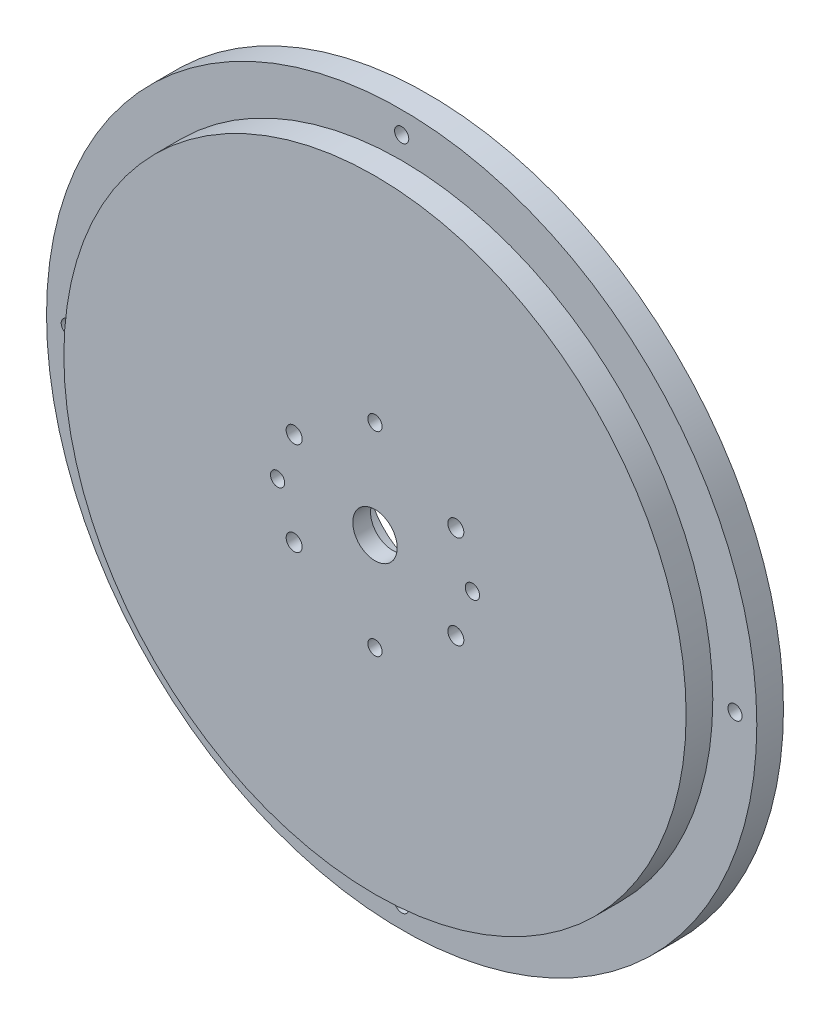
ISO-10303-21;
HEADER;
FILE_DESCRIPTION(('STEP AP214'),'2;1');
FILE_NAME('part.step','',(''),(''),'','','');
FILE_SCHEMA(('AUTOMOTIVE_DESIGN { 1 0 10303 214 1 1 1 1 }'));
ENDSEC;
DATA;
#1=APPLICATION_CONTEXT('core data for automotive mechanical design processes');
#2=APPLICATION_PROTOCOL_DEFINITION('international standard','automotive_design',2000,#1);
#3=PRODUCT_CONTEXT('',#1,'mechanical');
#4=PRODUCT('Part','Part','',(#3));
#5=PRODUCT_RELATED_PRODUCT_CATEGORY('part','',(#4));
#6=PRODUCT_DEFINITION_FORMATION('','',#4);
#7=PRODUCT_DEFINITION_CONTEXT('part definition',#1,'design');
#8=PRODUCT_DEFINITION('design','',#6,#7);
#9=PRODUCT_DEFINITION_SHAPE('','',#8);
#10=(LENGTH_UNIT() NAMED_UNIT(*) SI_UNIT(.MILLI.,.METRE.));
#11=(NAMED_UNIT(*) PLANE_ANGLE_UNIT() SI_UNIT($,.RADIAN.));
#12=(NAMED_UNIT(*) SI_UNIT($,.STERADIAN.) SOLID_ANGLE_UNIT());
#13=UNCERTAINTY_MEASURE_WITH_UNIT(LENGTH_MEASURE(1.E-05),#10,'distance_accuracy_value','');
#14=(GEOMETRIC_REPRESENTATION_CONTEXT(3) GLOBAL_UNCERTAINTY_ASSIGNED_CONTEXT((#13)) GLOBAL_UNIT_ASSIGNED_CONTEXT((#10,
#11,#12)) REPRESENTATION_CONTEXT('',''));
#15=CARTESIAN_POINT('',(0.,0.,0.));
#16=DIRECTION('',(0.,0.,1.));
#17=DIRECTION('',(1.,0.,0.));
#18=AXIS2_PLACEMENT_3D('',#15,#16,#17);
#19=CARTESIAN_POINT('',(0.,0.,20.));
#20=DIRECTION('',(0.,0.,-1.));
#21=DIRECTION('',(-1.,0.,0.));
#22=AXIS2_PLACEMENT_3D('',#19,#20,#21);
#23=CYLINDRICAL_SURFACE('',#22,5.);
#24=CARTESIAN_POINT('',(0.,0.,12.));
#25=DIRECTION('',(0.,0.,1.));
#26=DIRECTION('',(1.,0.,0.));
#27=AXIS2_PLACEMENT_3D('',#24,#25,#26);
#28=CIRCLE('',#27,5.);
#29=CARTESIAN_POINT('',(5.,0.,12.));
#30=VERTEX_POINT('',#29);
#31=EDGE_CURVE('E97',#30,#30,#28,.T.);
#32=ORIENTED_EDGE('',*,*,#31,.T.);
#33=EDGE_LOOP('',(#32));
#34=FACE_BOUND('',#33,.T.);
#35=CARTESIAN_POINT('',(0.,0.,8.));
#36=DIRECTION('',(0.,0.,-1.));
#37=DIRECTION('',(-1.,0.,0.));
#38=AXIS2_PLACEMENT_3D('',#35,#36,#37);
#39=CIRCLE('',#38,5.);
#40=CARTESIAN_POINT('',(-5.,0.,8.));
#41=VERTEX_POINT('',#40);
#42=EDGE_CURVE('E37',#41,#41,#39,.F.);
#43=ORIENTED_EDGE('',*,*,#42,.F.);
#44=EDGE_LOOP('',(#43));
#45=FACE_BOUND('',#44,.T.);
#46=ADVANCED_FACE('F33',(#34,#45),#23,.F.);
#47=CARTESIAN_POINT('',(0.,0.,12.));
#48=DIRECTION('',(0.,0.,-1.));
#49=DIRECTION('',(-1.,0.,0.));
#50=AXIS2_PLACEMENT_3D('',#47,#48,#49);
#51=CYLINDRICAL_SURFACE('',#50,70.);
#52=CARTESIAN_POINT('',(0.,0.,6.));
#53=DIRECTION('',(0.,0.,1.));
#54=DIRECTION('',(1.,0.,0.));
#55=AXIS2_PLACEMENT_3D('',#52,#53,#54);
#56=CIRCLE('',#55,70.);
#57=CARTESIAN_POINT('',(70.,0.,6.));
#58=VERTEX_POINT('',#57);
#59=EDGE_CURVE('E41',#58,#58,#56,.T.);
#60=ORIENTED_EDGE('',*,*,#59,.T.);
#61=EDGE_LOOP('',(#60));
#62=FACE_BOUND('',#61,.T.);
#63=CARTESIAN_POINT('',(0.,0.,12.));
#64=DIRECTION('',(0.,0.,1.));
#65=DIRECTION('',(1.,0.,0.));
#66=AXIS2_PLACEMENT_3D('',#63,#64,#65);
#67=CIRCLE('',#66,70.);
#68=CARTESIAN_POINT('',(70.,0.,12.));
#69=VERTEX_POINT('',#68);
#70=EDGE_CURVE('E10',#69,#69,#67,.T.);
#71=ORIENTED_EDGE('',*,*,#70,.F.);
#72=EDGE_LOOP('',(#71));
#73=FACE_BOUND('',#72,.T.);
#74=ADVANCED_FACE('F35',(#62,#73),#51,.T.);
#75=CARTESIAN_POINT('',(0.,0.,12.));
#76=DIRECTION('',(0.,0.,1.));
#77=DIRECTION('',(1.,0.,0.));
#78=AXIS2_PLACEMENT_3D('',#75,#76,#77);
#79=PLANE('',#78);
#80=CARTESIAN_POINT('',(18.1865334794733,-10.4999999999998,12.));
#81=DIRECTION('',(0.,0.,1.));
#82=DIRECTION('',(1.,0.,0.));
#83=AXIS2_PLACEMENT_3D('',#80,#81,#82);
#84=CIRCLE('',#83,1.8);
#85=CARTESIAN_POINT('',(19.9865334794733,-10.4999999999998,12.));
#86=VERTEX_POINT('',#85);
#87=EDGE_CURVE('E104',#86,#86,#84,.T.);
#88=ORIENTED_EDGE('',*,*,#87,.F.);
#89=EDGE_LOOP('',(#88));
#90=FACE_BOUND('',#89,.T.);
#91=CARTESIAN_POINT('',(-18.1865334794732,-10.5000000000001,12.));
#92=DIRECTION('',(0.,0.,1.));
#93=DIRECTION('',(1.,0.,0.));
#94=AXIS2_PLACEMENT_3D('',#91,#92,#93);
#95=CIRCLE('',#94,1.8);
#96=CARTESIAN_POINT('',(-16.3865334794732,-10.5000000000001,12.));
#97=VERTEX_POINT('',#96);
#98=EDGE_CURVE('E107',#97,#97,#95,.T.);
#99=ORIENTED_EDGE('',*,*,#98,.F.);
#100=EDGE_LOOP('',(#99));
#101=FACE_BOUND('',#100,.T.);
#102=CARTESIAN_POINT('',(-18.1865334794732,10.5,12.));
#103=DIRECTION('',(0.,0.,1.));
#104=DIRECTION('',(1.,0.,0.));
#105=AXIS2_PLACEMENT_3D('',#102,#103,#104);
#106=CIRCLE('',#105,1.8);
#107=CARTESIAN_POINT('',(-16.3865334794732,10.5,12.));
#108=VERTEX_POINT('',#107);
#109=EDGE_CURVE('E110',#108,#108,#106,.T.);
#110=ORIENTED_EDGE('',*,*,#109,.F.);
#111=EDGE_LOOP('',(#110));
#112=FACE_BOUND('',#111,.T.);
#113=CARTESIAN_POINT('',(18.1865334794732,10.5,12.));
#114=DIRECTION('',(0.,0.,1.));
#115=DIRECTION('',(1.,0.,0.));
#116=AXIS2_PLACEMENT_3D('',#113,#114,#115);
#117=CIRCLE('',#116,1.8);
#118=CARTESIAN_POINT('',(19.9865334794732,10.5,12.));
#119=VERTEX_POINT('',#118);
#120=EDGE_CURVE('E113',#119,#119,#117,.T.);
#121=ORIENTED_EDGE('',*,*,#120,.F.);
#122=EDGE_LOOP('',(#121));
#123=FACE_BOUND('',#122,.T.);
#124=ORIENTED_EDGE('',*,*,#31,.F.);
#125=EDGE_LOOP('',(#124));
#126=FACE_BOUND('',#125,.T.);
#127=CARTESIAN_POINT('',(21.9203,0.,12.));
#128=DIRECTION('',(0.,0.,1.));
#129=DIRECTION('',(1.,0.,0.));
#130=AXIS2_PLACEMENT_3D('',#127,#128,#129);
#131=CIRCLE('',#130,1.6);
#132=CARTESIAN_POINT('',(23.5203,0.,12.));
#133=VERTEX_POINT('',#132);
#134=EDGE_CURVE('E83',#133,#133,#131,.T.);
#135=ORIENTED_EDGE('',*,*,#134,.F.);
#136=EDGE_LOOP('',(#135));
#137=FACE_BOUND('',#136,.T.);
#138=CARTESIAN_POINT('',(0.,21.9203000000002,12.));
#139=DIRECTION('',(0.,0.,1.));
#140=DIRECTION('',(1.,0.,0.));
#141=AXIS2_PLACEMENT_3D('',#138,#139,#140);
#142=CIRCLE('',#141,1.6000000000002);
#143=CARTESIAN_POINT('',(1.60000000000028,21.9203000000002,12.));
#144=VERTEX_POINT('',#143);
#145=EDGE_CURVE('E86',#144,#144,#142,.T.);
#146=ORIENTED_EDGE('',*,*,#145,.F.);
#147=EDGE_LOOP('',(#146));
#148=FACE_BOUND('',#147,.T.);
#149=CARTESIAN_POINT('',(-21.9203,-1.53068636783686E-13,12.));
#150=DIRECTION('',(0.,0.,1.));
#151=DIRECTION('',(1.,0.,0.));
#152=AXIS2_PLACEMENT_3D('',#149,#150,#151);
#153=CIRCLE('',#152,1.6);
#154=CARTESIAN_POINT('',(-20.3203,-1.53068636783686E-13,12.));
#155=VERTEX_POINT('',#154);
#156=EDGE_CURVE('E89',#155,#155,#153,.T.);
#157=ORIENTED_EDGE('',*,*,#156,.F.);
#158=EDGE_LOOP('',(#157));
#159=FACE_BOUND('',#158,.T.);
#160=CARTESIAN_POINT('',(5.15091550885208E-13,-21.9202999999998,12.));
#161=DIRECTION('',(0.,0.,1.));
#162=DIRECTION('',(1.,0.,0.));
#163=AXIS2_PLACEMENT_3D('',#160,#161,#162);
#164=CIRCLE('',#163,1.59999999999976);
#165=CARTESIAN_POINT('',(1.60000000000027,-21.9202999999998,12.));
#166=VERTEX_POINT('',#165);
#167=EDGE_CURVE('E70',#166,#166,#164,.T.);
#168=ORIENTED_EDGE('',*,*,#167,.F.);
#169=EDGE_LOOP('',(#168));
#170=FACE_BOUND('',#169,.T.);
#171=ORIENTED_EDGE('',*,*,#70,.T.);
#172=EDGE_LOOP('',(#171));
#173=FACE_BOUND('',#172,.T.);
#174=ADVANCED_FACE('F146',(#90,#101,#112,#123,#126,#137,#148,#159,#170,#173),#79,.T.);
#175=CARTESIAN_POINT('',(0.,0.,6.));
#176=DIRECTION('',(0.,0.,-1.));
#177=DIRECTION('',(-1.,0.,0.));
#178=AXIS2_PLACEMENT_3D('',#175,#176,#177);
#179=CYLINDRICAL_SURFACE('',#178,79.9);
#180=CARTESIAN_POINT('',(0.,0.,6.));
#181=DIRECTION('',(0.,0.,1.));
#182=DIRECTION('',(1.,0.,0.));
#183=AXIS2_PLACEMENT_3D('',#180,#181,#182);
#184=CIRCLE('',#183,79.9);
#185=CARTESIAN_POINT('',(79.9,0.,6.));
#186=VERTEX_POINT('',#185);
#187=EDGE_CURVE('E46',#186,#186,#184,.T.);
#188=ORIENTED_EDGE('',*,*,#187,.F.);
#189=EDGE_LOOP('',(#188));
#190=FACE_BOUND('',#189,.T.);
#191=CARTESIAN_POINT('',(0.,0.,0.));
#192=DIRECTION('',(0.,0.,1.));
#193=DIRECTION('',(1.,0.,0.));
#194=AXIS2_PLACEMENT_3D('',#191,#192,#193);
#195=CIRCLE('',#194,79.9);
#196=CARTESIAN_POINT('',(79.9,0.,0.));
#197=VERTEX_POINT('',#196);
#198=EDGE_CURVE('E48',#197,#197,#195,.T.);
#199=ORIENTED_EDGE('',*,*,#198,.T.);
#200=EDGE_LOOP('',(#199));
#201=FACE_BOUND('',#200,.T.);
#202=ADVANCED_FACE('F188',(#190,#201),#179,.T.);
#203=CARTESIAN_POINT('',(0.,0.,6.));
#204=DIRECTION('',(0.,0.,1.));
#205=DIRECTION('',(1.,0.,0.));
#206=AXIS2_PLACEMENT_3D('',#203,#204,#205);
#207=PLANE('',#206);
#208=CARTESIAN_POINT('',(-75.,0.,6.));
#209=DIRECTION('',(0.,0.,1.));
#210=DIRECTION('',(1.,0.,0.));
#211=AXIS2_PLACEMENT_3D('',#208,#209,#210);
#212=CIRCLE('',#211,1.60000000000001);
#213=CARTESIAN_POINT('',(-73.4,0.,6.));
#214=VERTEX_POINT('',#213);
#215=EDGE_CURVE('E51',#214,#214,#212,.F.);
#216=ORIENTED_EDGE('',*,*,#215,.T.);
#217=EDGE_LOOP('',(#216));
#218=FACE_BOUND('',#217,.T.);
#219=CARTESIAN_POINT('',(75.,0.,6.));
#220=DIRECTION('',(0.,0.,1.));
#221=DIRECTION('',(1.,0.,0.));
#222=AXIS2_PLACEMENT_3D('',#219,#220,#221);
#223=CIRCLE('',#222,1.60000000000001);
#224=CARTESIAN_POINT('',(76.6,0.,6.));
#225=VERTEX_POINT('',#224);
#226=EDGE_CURVE('E56',#225,#225,#223,.F.);
#227=ORIENTED_EDGE('',*,*,#226,.T.);
#228=EDGE_LOOP('',(#227));
#229=FACE_BOUND('',#228,.T.);
#230=CARTESIAN_POINT('',(0.,-75.,6.));
#231=DIRECTION('',(0.,0.,1.));
#232=DIRECTION('',(1.,0.,0.));
#233=AXIS2_PLACEMENT_3D('',#230,#231,#232);
#234=CIRCLE('',#233,1.6);
#235=CARTESIAN_POINT('',(1.6,-75.,6.));
#236=VERTEX_POINT('',#235);
#237=EDGE_CURVE('E59',#236,#236,#234,.F.);
#238=ORIENTED_EDGE('',*,*,#237,.T.);
#239=EDGE_LOOP('',(#238));
#240=FACE_BOUND('',#239,.T.);
#241=CARTESIAN_POINT('',(0.,75.,6.));
#242=DIRECTION('',(0.,0.,1.));
#243=DIRECTION('',(1.,0.,0.));
#244=AXIS2_PLACEMENT_3D('',#241,#242,#243);
#245=CIRCLE('',#244,1.6);
#246=CARTESIAN_POINT('',(1.6,75.,6.));
#247=VERTEX_POINT('',#246);
#248=EDGE_CURVE('E62',#247,#247,#245,.F.);
#249=ORIENTED_EDGE('',*,*,#248,.T.);
#250=EDGE_LOOP('',(#249));
#251=FACE_BOUND('',#250,.T.);
#252=ORIENTED_EDGE('',*,*,#59,.F.);
#253=EDGE_LOOP('',(#252));
#254=FACE_BOUND('',#253,.T.);
#255=ORIENTED_EDGE('',*,*,#187,.T.);
#256=EDGE_LOOP('',(#255));
#257=FACE_BOUND('',#256,.T.);
#258=ADVANCED_FACE('F185',(#218,#229,#240,#251,#254,#257),#207,.T.);
#259=CARTESIAN_POINT('',(0.,0.,0.));
#260=DIRECTION('',(0.,0.,1.));
#261=DIRECTION('',(1.,0.,0.));
#262=AXIS2_PLACEMENT_3D('',#259,#260,#261);
#263=PLANE('',#262);
#264=CARTESIAN_POINT('',(0.,0.,0.));
#265=DIRECTION('',(0.,0.,-1.));
#266=DIRECTION('',(-1.,0.,0.));
#267=AXIS2_PLACEMENT_3D('',#264,#265,#266);
#268=CIRCLE('',#267,14.);
#269=CARTESIAN_POINT('',(-14.,0.,0.));
#270=VERTEX_POINT('',#269);
#271=EDGE_CURVE('E128',#270,#270,#268,.T.);
#272=ORIENTED_EDGE('',*,*,#271,.F.);
#273=EDGE_LOOP('',(#272));
#274=FACE_BOUND('',#273,.T.);
#275=CARTESIAN_POINT('',(18.1865334794733,-10.4999999999998,0.));
#276=DIRECTION('',(0.,0.,-1.));
#277=DIRECTION('',(-1.,0.,0.));
#278=AXIS2_PLACEMENT_3D('',#275,#276,#277);
#279=CIRCLE('',#278,1.8);
#280=CARTESIAN_POINT('',(16.3865334794733,-10.4999999999998,0.));
#281=VERTEX_POINT('',#280);
#282=EDGE_CURVE('E120',#281,#281,#279,.T.);
#283=ORIENTED_EDGE('',*,*,#282,.F.);
#284=EDGE_LOOP('',(#283));
#285=FACE_BOUND('',#284,.T.);
#286=CARTESIAN_POINT('',(-18.1865334794732,-10.5000000000001,0.));
#287=DIRECTION('',(0.,0.,-1.));
#288=DIRECTION('',(-1.,0.,0.));
#289=AXIS2_PLACEMENT_3D('',#286,#287,#288);
#290=CIRCLE('',#289,1.8);
#291=CARTESIAN_POINT('',(-19.9865334794732,-10.5000000000001,0.));
#292=VERTEX_POINT('',#291);
#293=EDGE_CURVE('E123',#292,#292,#290,.T.);
#294=ORIENTED_EDGE('',*,*,#293,.F.);
#295=EDGE_LOOP('',(#294));
#296=FACE_BOUND('',#295,.T.);
#297=CARTESIAN_POINT('',(-18.1865334794732,10.5,0.));
#298=DIRECTION('',(0.,0.,-1.));
#299=DIRECTION('',(-1.,0.,0.));
#300=AXIS2_PLACEMENT_3D('',#297,#298,#299);
#301=CIRCLE('',#300,1.8);
#302=CARTESIAN_POINT('',(-19.9865334794732,10.5,0.));
#303=VERTEX_POINT('',#302);
#304=EDGE_CURVE('E119',#303,#303,#301,.T.);
#305=ORIENTED_EDGE('',*,*,#304,.F.);
#306=EDGE_LOOP('',(#305));
#307=FACE_BOUND('',#306,.T.);
#308=CARTESIAN_POINT('',(18.1865334794732,10.5,0.));
#309=DIRECTION('',(0.,0.,-1.));
#310=DIRECTION('',(-1.,0.,0.));
#311=AXIS2_PLACEMENT_3D('',#308,#309,#310);
#312=CIRCLE('',#311,1.8);
#313=CARTESIAN_POINT('',(16.3865334794732,10.5,0.));
#314=VERTEX_POINT('',#313);
#315=EDGE_CURVE('E116',#314,#314,#312,.T.);
#316=ORIENTED_EDGE('',*,*,#315,.F.);
#317=EDGE_LOOP('',(#316));
#318=FACE_BOUND('',#317,.T.);
#319=CARTESIAN_POINT('',(21.9203,0.,0.));
#320=DIRECTION('',(0.,0.,-1.));
#321=DIRECTION('',(-1.,0.,0.));
#322=AXIS2_PLACEMENT_3D('',#319,#320,#321);
#323=CIRCLE('',#322,1.6);
#324=CARTESIAN_POINT('',(20.3203,0.,0.));
#325=VERTEX_POINT('',#324);
#326=EDGE_CURVE('E92',#325,#325,#323,.T.);
#327=ORIENTED_EDGE('',*,*,#326,.F.);
#328=EDGE_LOOP('',(#327));
#329=FACE_BOUND('',#328,.T.);
#330=CARTESIAN_POINT('',(0.,21.9203000000002,0.));
#331=DIRECTION('',(0.,0.,-1.));
#332=DIRECTION('',(-1.,0.,0.));
#333=AXIS2_PLACEMENT_3D('',#330,#331,#332);
#334=CIRCLE('',#333,1.6000000000002);
#335=CARTESIAN_POINT('',(-1.60000000000012,21.9203000000002,0.));
#336=VERTEX_POINT('',#335);
#337=EDGE_CURVE('E96',#336,#336,#334,.T.);
#338=ORIENTED_EDGE('',*,*,#337,.F.);
#339=EDGE_LOOP('',(#338));
#340=FACE_BOUND('',#339,.T.);
#341=CARTESIAN_POINT('',(-21.9203,-1.53068636783686E-13,0.));
#342=DIRECTION('',(0.,0.,-1.));
#343=DIRECTION('',(-1.,0.,0.));
#344=AXIS2_PLACEMENT_3D('',#341,#342,#343);
#345=CIRCLE('',#344,1.6);
#346=CARTESIAN_POINT('',(-23.5203,-1.53068636783686E-13,0.));
#347=VERTEX_POINT('',#346);
#348=EDGE_CURVE('E93',#347,#347,#345,.T.);
#349=ORIENTED_EDGE('',*,*,#348,.F.);
#350=EDGE_LOOP('',(#349));
#351=FACE_BOUND('',#350,.T.);
#352=CARTESIAN_POINT('',(5.15091550885208E-13,-21.9202999999998,0.));
#353=DIRECTION('',(0.,0.,-1.));
#354=DIRECTION('',(-1.,0.,0.));
#355=AXIS2_PLACEMENT_3D('',#352,#353,#354);
#356=CIRCLE('',#355,1.59999999999976);
#357=CARTESIAN_POINT('',(-1.59999999999924,-21.9202999999998,0.));
#358=VERTEX_POINT('',#357);
#359=EDGE_CURVE('E80',#358,#358,#356,.T.);
#360=ORIENTED_EDGE('',*,*,#359,.F.);
#361=EDGE_LOOP('',(#360));
#362=FACE_BOUND('',#361,.T.);
#363=CARTESIAN_POINT('',(-75.,0.,0.));
#364=DIRECTION('',(0.,0.,1.));
#365=DIRECTION('',(1.,0.,0.));
#366=AXIS2_PLACEMENT_3D('',#363,#364,#365);
#367=CIRCLE('',#366,1.60000000000001);
#368=CARTESIAN_POINT('',(-73.4,0.,0.));
#369=VERTEX_POINT('',#368);
#370=EDGE_CURVE('E65',#369,#369,#367,.T.);
#371=ORIENTED_EDGE('',*,*,#370,.T.);
#372=EDGE_LOOP('',(#371));
#373=FACE_BOUND('',#372,.T.);
#374=CARTESIAN_POINT('',(75.,0.,0.));
#375=DIRECTION('',(0.,0.,1.));
#376=DIRECTION('',(1.,0.,0.));
#377=AXIS2_PLACEMENT_3D('',#374,#375,#376);
#378=CIRCLE('',#377,1.60000000000001);
#379=CARTESIAN_POINT('',(76.6,0.,0.));
#380=VERTEX_POINT('',#379);
#381=EDGE_CURVE('E73',#380,#380,#378,.T.);
#382=ORIENTED_EDGE('',*,*,#381,.T.);
#383=EDGE_LOOP('',(#382));
#384=FACE_BOUND('',#383,.T.);
#385=CARTESIAN_POINT('',(0.,-75.,0.));
#386=DIRECTION('',(0.,0.,1.));
#387=DIRECTION('',(1.,0.,0.));
#388=AXIS2_PLACEMENT_3D('',#385,#386,#387);
#389=CIRCLE('',#388,1.6);
#390=CARTESIAN_POINT('',(1.6,-75.,0.));
#391=VERTEX_POINT('',#390);
#392=EDGE_CURVE('E69',#391,#391,#389,.T.);
#393=ORIENTED_EDGE('',*,*,#392,.T.);
#394=EDGE_LOOP('',(#393));
#395=FACE_BOUND('',#394,.T.);
#396=CARTESIAN_POINT('',(0.,75.,0.));
#397=DIRECTION('',(0.,0.,1.));
#398=DIRECTION('',(1.,0.,0.));
#399=AXIS2_PLACEMENT_3D('',#396,#397,#398);
#400=CIRCLE('',#399,1.6);
#401=CARTESIAN_POINT('',(1.6,75.,0.));
#402=VERTEX_POINT('',#401);
#403=EDGE_CURVE('E66',#402,#402,#400,.T.);
#404=ORIENTED_EDGE('',*,*,#403,.T.);
#405=EDGE_LOOP('',(#404));
#406=FACE_BOUND('',#405,.T.);
#407=ORIENTED_EDGE('',*,*,#198,.F.);
#408=EDGE_LOOP('',(#407));
#409=FACE_BOUND('',#408,.T.);
#410=ADVANCED_FACE('F183',(#274,#285,#296,#307,#318,#329,#340,#351,#362,#373,#384,#395,#406,
#409),#263,.F.);
#411=CARTESIAN_POINT('',(0.,75.,10.));
#412=DIRECTION('',(0.,0.,-1.));
#413=DIRECTION('',(-1.,0.,0.));
#414=AXIS2_PLACEMENT_3D('',#411,#412,#413);
#415=CYLINDRICAL_SURFACE('',#414,1.6);
#416=ORIENTED_EDGE('',*,*,#248,.F.);
#417=EDGE_LOOP('',(#416));
#418=FACE_BOUND('',#417,.T.);
#419=ORIENTED_EDGE('',*,*,#403,.F.);
#420=EDGE_LOOP('',(#419));
#421=FACE_BOUND('',#420,.T.);
#422=ADVANCED_FACE('F179',(#418,#421),#415,.F.);
#423=CARTESIAN_POINT('',(0.,-75.,10.));
#424=DIRECTION('',(0.,0.,-1.));
#425=DIRECTION('',(-1.,0.,0.));
#426=AXIS2_PLACEMENT_3D('',#423,#424,#425);
#427=CYLINDRICAL_SURFACE('',#426,1.6);
#428=ORIENTED_EDGE('',*,*,#237,.F.);
#429=EDGE_LOOP('',(#428));
#430=FACE_BOUND('',#429,.T.);
#431=ORIENTED_EDGE('',*,*,#392,.F.);
#432=EDGE_LOOP('',(#431));
#433=FACE_BOUND('',#432,.T.);
#434=ADVANCED_FACE('F175',(#430,#433),#427,.F.);
#435=CARTESIAN_POINT('',(75.,0.,10.));
#436=DIRECTION('',(0.,0.,-1.));
#437=DIRECTION('',(-1.,0.,0.));
#438=AXIS2_PLACEMENT_3D('',#435,#436,#437);
#439=CYLINDRICAL_SURFACE('',#438,1.60000000000001);
#440=ORIENTED_EDGE('',*,*,#226,.F.);
#441=EDGE_LOOP('',(#440));
#442=FACE_BOUND('',#441,.T.);
#443=ORIENTED_EDGE('',*,*,#381,.F.);
#444=EDGE_LOOP('',(#443));
#445=FACE_BOUND('',#444,.T.);
#446=ADVANCED_FACE('F171',(#442,#445),#439,.F.);
#447=CARTESIAN_POINT('',(-75.,0.,10.));
#448=DIRECTION('',(0.,0.,-1.));
#449=DIRECTION('',(-1.,0.,0.));
#450=AXIS2_PLACEMENT_3D('',#447,#448,#449);
#451=CYLINDRICAL_SURFACE('',#450,1.60000000000001);
#452=ORIENTED_EDGE('',*,*,#215,.F.);
#453=EDGE_LOOP('',(#452));
#454=FACE_BOUND('',#453,.T.);
#455=ORIENTED_EDGE('',*,*,#370,.F.);
#456=EDGE_LOOP('',(#455));
#457=FACE_BOUND('',#456,.T.);
#458=ADVANCED_FACE('F167',(#454,#457),#451,.F.);
#459=CARTESIAN_POINT('',(5.15091550885208E-13,-21.9202999999998,20.));
#460=DIRECTION('',(0.,0.,-1.));
#461=DIRECTION('',(-1.,0.,0.));
#462=AXIS2_PLACEMENT_3D('',#459,#460,#461);
#463=CYLINDRICAL_SURFACE('',#462,1.59999999999976);
#464=ORIENTED_EDGE('',*,*,#167,.T.);
#465=EDGE_LOOP('',(#464));
#466=FACE_BOUND('',#465,.T.);
#467=ORIENTED_EDGE('',*,*,#359,.T.);
#468=EDGE_LOOP('',(#467));
#469=FACE_BOUND('',#468,.T.);
#470=ADVANCED_FACE('F163',(#466,#469),#463,.F.);
#471=CARTESIAN_POINT('',(-21.9203,-1.53068636783686E-13,20.));
#472=DIRECTION('',(0.,0.,-1.));
#473=DIRECTION('',(-1.,0.,0.));
#474=AXIS2_PLACEMENT_3D('',#471,#472,#473);
#475=CYLINDRICAL_SURFACE('',#474,1.6);
#476=ORIENTED_EDGE('',*,*,#156,.T.);
#477=EDGE_LOOP('',(#476));
#478=FACE_BOUND('',#477,.T.);
#479=ORIENTED_EDGE('',*,*,#348,.T.);
#480=EDGE_LOOP('',(#479));
#481=FACE_BOUND('',#480,.T.);
#482=ADVANCED_FACE('F159',(#478,#481),#475,.F.);
#483=CARTESIAN_POINT('',(0.,21.9203000000002,20.));
#484=DIRECTION('',(0.,0.,-1.));
#485=DIRECTION('',(-1.,0.,0.));
#486=AXIS2_PLACEMENT_3D('',#483,#484,#485);
#487=CYLINDRICAL_SURFACE('',#486,1.6000000000002);
#488=ORIENTED_EDGE('',*,*,#145,.T.);
#489=EDGE_LOOP('',(#488));
#490=FACE_BOUND('',#489,.T.);
#491=ORIENTED_EDGE('',*,*,#337,.T.);
#492=EDGE_LOOP('',(#491));
#493=FACE_BOUND('',#492,.T.);
#494=ADVANCED_FACE('F155',(#490,#493),#487,.F.);
#495=CARTESIAN_POINT('',(21.9203,0.,20.));
#496=DIRECTION('',(0.,0.,-1.));
#497=DIRECTION('',(-1.,0.,0.));
#498=AXIS2_PLACEMENT_3D('',#495,#496,#497);
#499=CYLINDRICAL_SURFACE('',#498,1.6);
#500=ORIENTED_EDGE('',*,*,#134,.T.);
#501=EDGE_LOOP('',(#500));
#502=FACE_BOUND('',#501,.T.);
#503=ORIENTED_EDGE('',*,*,#326,.T.);
#504=EDGE_LOOP('',(#503));
#505=FACE_BOUND('',#504,.T.);
#506=ADVANCED_FACE('F152',(#502,#505),#499,.F.);
#507=CARTESIAN_POINT('',(18.1865334794732,10.5,30.));
#508=DIRECTION('',(0.,0.,-1.));
#509=DIRECTION('',(-1.,0.,0.));
#510=AXIS2_PLACEMENT_3D('',#507,#508,#509);
#511=CYLINDRICAL_SURFACE('',#510,1.8);
#512=ORIENTED_EDGE('',*,*,#120,.T.);
#513=EDGE_LOOP('',(#512));
#514=FACE_BOUND('',#513,.T.);
#515=ORIENTED_EDGE('',*,*,#315,.T.);
#516=EDGE_LOOP('',(#515));
#517=FACE_BOUND('',#516,.T.);
#518=ADVANCED_FACE('F150',(#514,#517),#511,.F.);
#519=CARTESIAN_POINT('',(-18.1865334794732,10.5,30.));
#520=DIRECTION('',(0.,0.,-1.));
#521=DIRECTION('',(-1.,0.,0.));
#522=AXIS2_PLACEMENT_3D('',#519,#520,#521);
#523=CYLINDRICAL_SURFACE('',#522,1.8);
#524=ORIENTED_EDGE('',*,*,#109,.T.);
#525=EDGE_LOOP('',(#524));
#526=FACE_BOUND('',#525,.T.);
#527=ORIENTED_EDGE('',*,*,#304,.T.);
#528=EDGE_LOOP('',(#527));
#529=FACE_BOUND('',#528,.T.);
#530=ADVANCED_FACE('F237',(#526,#529),#523,.F.);
#531=CARTESIAN_POINT('',(-18.1865334794732,-10.5000000000001,30.));
#532=DIRECTION('',(0.,0.,-1.));
#533=DIRECTION('',(-1.,0.,0.));
#534=AXIS2_PLACEMENT_3D('',#531,#532,#533);
#535=CYLINDRICAL_SURFACE('',#534,1.8);
#536=ORIENTED_EDGE('',*,*,#98,.T.);
#537=EDGE_LOOP('',(#536));
#538=FACE_BOUND('',#537,.T.);
#539=ORIENTED_EDGE('',*,*,#293,.T.);
#540=EDGE_LOOP('',(#539));
#541=FACE_BOUND('',#540,.T.);
#542=ADVANCED_FACE('F242',(#538,#541),#535,.F.);
#543=CARTESIAN_POINT('',(18.1865334794733,-10.4999999999998,30.));
#544=DIRECTION('',(0.,0.,-1.));
#545=DIRECTION('',(-1.,0.,0.));
#546=AXIS2_PLACEMENT_3D('',#543,#544,#545);
#547=CYLINDRICAL_SURFACE('',#546,1.8);
#548=ORIENTED_EDGE('',*,*,#87,.T.);
#549=EDGE_LOOP('',(#548));
#550=FACE_BOUND('',#549,.T.);
#551=ORIENTED_EDGE('',*,*,#282,.T.);
#552=EDGE_LOOP('',(#551));
#553=FACE_BOUND('',#552,.T.);
#554=ADVANCED_FACE('F260',(#550,#553),#547,.F.);
#555=CARTESIAN_POINT('',(0.,0.,8.));
#556=DIRECTION('',(0.,0.,-1.));
#557=DIRECTION('',(-1.,0.,0.));
#558=AXIS2_PLACEMENT_3D('',#555,#556,#557);
#559=PLANE('',#558);
#560=CARTESIAN_POINT('',(0.,0.,8.));
#561=DIRECTION('',(0.,0.,-1.));
#562=DIRECTION('',(-1.,0.,0.));
#563=AXIS2_PLACEMENT_3D('',#560,#561,#562);
#564=CIRCLE('',#563,14.);
#565=CARTESIAN_POINT('',(-14.,0.,8.));
#566=VERTEX_POINT('',#565);
#567=EDGE_CURVE('E131',#566,#566,#564,.T.);
#568=ORIENTED_EDGE('',*,*,#567,.T.);
#569=EDGE_LOOP('',(#568));
#570=FACE_BOUND('',#569,.T.);
#571=ORIENTED_EDGE('',*,*,#42,.T.);
#572=EDGE_LOOP('',(#571));
#573=FACE_BOUND('',#572,.T.);
#574=ADVANCED_FACE('F138',(#570,#573),#559,.T.);
#575=CARTESIAN_POINT('',(0.,0.,8.));
#576=DIRECTION('',(0.,0.,-1.));
#577=DIRECTION('',(-1.,0.,0.));
#578=AXIS2_PLACEMENT_3D('',#575,#576,#577);
#579=CYLINDRICAL_SURFACE('',#578,14.);
#580=ORIENTED_EDGE('',*,*,#567,.F.);
#581=EDGE_LOOP('',(#580));
#582=FACE_BOUND('',#581,.T.);
#583=ORIENTED_EDGE('',*,*,#271,.T.);
#584=EDGE_LOOP('',(#583));
#585=FACE_BOUND('',#584,.T.);
#586=ADVANCED_FACE('F265',(#582,#585),#579,.F.);
#587=CLOSED_SHELL('',(#46,#74,#174,#202,#258,#410,#422,#434,#446,#458,#470,#482,#494,#506,#518,
#530,#542,#554,#574,#586));
#588=MANIFOLD_SOLID_BREP('B2',#587);
#589=ADVANCED_BREP_SHAPE_REPRESENTATION('',(#18,#588),#14);
#590=SHAPE_DEFINITION_REPRESENTATION(#9,#589);
ENDSEC;
END-ISO-10303-21;
